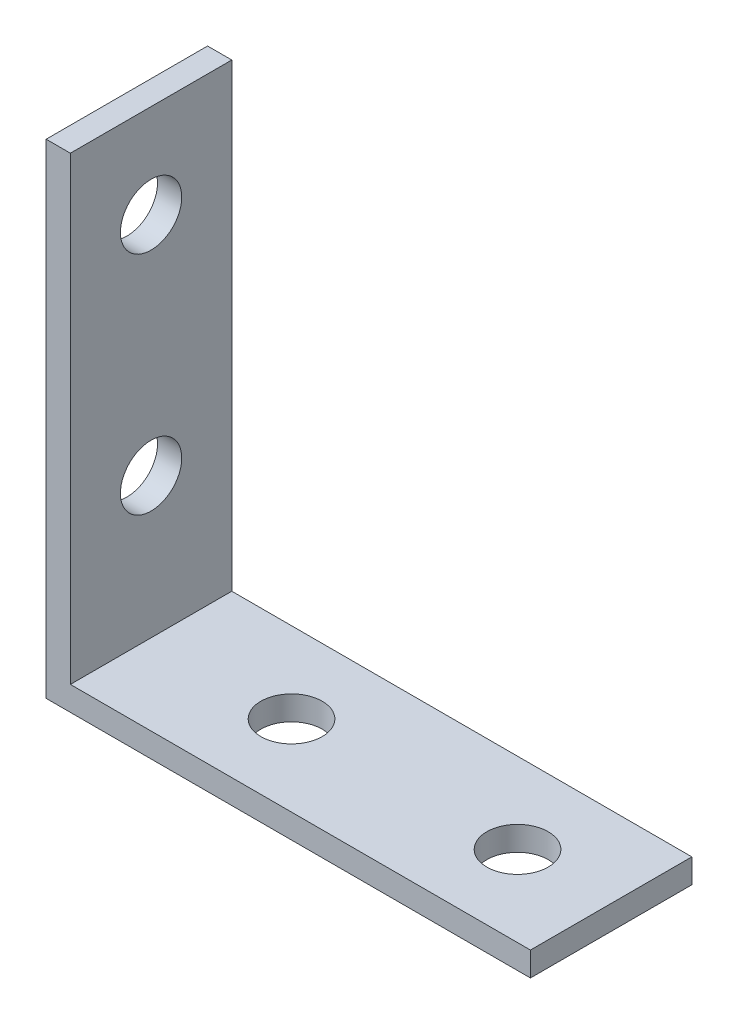
ISO-10303-21;
HEADER;
FILE_DESCRIPTION(('STEP AP214'),'2;1');
FILE_NAME('part.step','',(''),(''),'','','');
FILE_SCHEMA(('AUTOMOTIVE_DESIGN { 1 0 10303 214 1 1 1 1 }'));
ENDSEC;
DATA;
#1=APPLICATION_CONTEXT('core data for automotive mechanical design processes');
#2=APPLICATION_PROTOCOL_DEFINITION('international standard','automotive_design',2000,#1);
#3=PRODUCT_CONTEXT('',#1,'mechanical');
#4=PRODUCT('Part','Part','',(#3));
#5=PRODUCT_RELATED_PRODUCT_CATEGORY('part','',(#4));
#6=PRODUCT_DEFINITION_FORMATION('','',#4);
#7=PRODUCT_DEFINITION_CONTEXT('part definition',#1,'design');
#8=PRODUCT_DEFINITION('design','',#6,#7);
#9=PRODUCT_DEFINITION_SHAPE('','',#8);
#10=(LENGTH_UNIT() NAMED_UNIT(*) SI_UNIT(.MILLI.,.METRE.));
#11=(NAMED_UNIT(*) PLANE_ANGLE_UNIT() SI_UNIT($,.RADIAN.));
#12=(NAMED_UNIT(*) SI_UNIT($,.STERADIAN.) SOLID_ANGLE_UNIT());
#13=UNCERTAINTY_MEASURE_WITH_UNIT(LENGTH_MEASURE(1.E-05),#10,'distance_accuracy_value','');
#14=(GEOMETRIC_REPRESENTATION_CONTEXT(3) GLOBAL_UNCERTAINTY_ASSIGNED_CONTEXT((#13)) GLOBAL_UNIT_ASSIGNED_CONTEXT((#10,
#11,#12)) REPRESENTATION_CONTEXT('',''));
#15=CARTESIAN_POINT('',(0.,0.,0.));
#16=DIRECTION('',(0.,0.,1.));
#17=DIRECTION('',(1.,0.,0.));
#18=AXIS2_PLACEMENT_3D('',#15,#16,#17);
#19=CARTESIAN_POINT('',(38.1,0.,12.7));
#20=DIRECTION('',(0.,1.,0.));
#21=DIRECTION('',(-1.,0.,0.));
#22=AXIS2_PLACEMENT_3D('',#19,#20,#21);
#23=PLANE('',#22);
#24=CARTESIAN_POINT('',(30.734,0.,6.35));
#25=DIRECTION('',(0.,-1.,0.));
#26=DIRECTION('',(1.,0.,0.));
#27=AXIS2_PLACEMENT_3D('',#24,#25,#26);
#28=CIRCLE('',#27,2.413);
#29=CARTESIAN_POINT('',(33.147,0.,6.35));
#30=VERTEX_POINT('',#29);
#31=EDGE_CURVE('E163',#30,#30,#28,.T.);
#32=ORIENTED_EDGE('',*,*,#31,.F.);
#33=EDGE_LOOP('',(#32));
#34=FACE_BOUND('',#33,.T.);
#35=CARTESIAN_POINT('',(12.954,0.,6.35));
#36=DIRECTION('',(0.,-1.,0.));
#37=DIRECTION('',(1.,0.,0.));
#38=AXIS2_PLACEMENT_3D('',#35,#36,#37);
#39=CIRCLE('',#38,2.413);
#40=CARTESIAN_POINT('',(15.367,0.,6.35));
#41=VERTEX_POINT('',#40);
#42=EDGE_CURVE('E166',#41,#41,#39,.T.);
#43=ORIENTED_EDGE('',*,*,#42,.F.);
#44=EDGE_LOOP('',(#43));
#45=FACE_BOUND('',#44,.T.);
#46=DIRECTION('',(1.,0.,0.));
#47=VECTOR('',#46,1.);
#48=CARTESIAN_POINT('',(38.1,0.,0.));
#49=LINE('',#48,#47);
#50=CARTESIAN_POINT('',(0.,0.,0.));
#51=VERTEX_POINT('',#50);
#52=CARTESIAN_POINT('',(38.1,0.,0.));
#53=VERTEX_POINT('',#52);
#54=EDGE_CURVE('E117',#51,#53,#49,.T.);
#55=ORIENTED_EDGE('',*,*,#54,.T.);
#56=DIRECTION('',(0.,0.,-1.));
#57=VECTOR('',#56,1.);
#58=CARTESIAN_POINT('',(38.1,0.,12.7));
#59=LINE('',#58,#57);
#60=CARTESIAN_POINT('',(38.1,0.,12.7));
#61=VERTEX_POINT('',#60);
#62=EDGE_CURVE('E11',#61,#53,#59,.T.);
#63=ORIENTED_EDGE('',*,*,#62,.F.);
#64=DIRECTION('',(1.,0.,0.));
#65=VECTOR('',#64,1.);
#66=CARTESIAN_POINT('',(38.1,0.,12.7));
#67=LINE('',#66,#65);
#68=CARTESIAN_POINT('',(0.,0.,12.7));
#69=VERTEX_POINT('',#68);
#70=EDGE_CURVE('E128',#69,#61,#67,.T.);
#71=ORIENTED_EDGE('',*,*,#70,.F.);
#72=DIRECTION('',(0.,0.,-1.));
#73=VECTOR('',#72,1.);
#74=CARTESIAN_POINT('',(0.,0.,12.7));
#75=LINE('',#74,#73);
#76=EDGE_CURVE('E113',#69,#51,#75,.T.);
#77=ORIENTED_EDGE('',*,*,#76,.T.);
#78=EDGE_LOOP('',(#55,#63,#71,#77));
#79=FACE_BOUND('',#78,.T.);
#80=ADVANCED_FACE('F33',(#34,#45,#79),#23,.F.);
#81=CARTESIAN_POINT('',(38.1,1.905,12.7));
#82=DIRECTION('',(-1.,0.,0.));
#83=DIRECTION('',(0.,-1.,0.));
#84=AXIS2_PLACEMENT_3D('',#81,#82,#83);
#85=PLANE('',#84);
#86=DIRECTION('',(0.,1.,0.));
#87=VECTOR('',#86,1.);
#88=CARTESIAN_POINT('',(38.1,1.905,0.));
#89=LINE('',#88,#87);
#90=CARTESIAN_POINT('',(38.1,1.905,0.));
#91=VERTEX_POINT('',#90);
#92=EDGE_CURVE('E120',#53,#91,#89,.T.);
#93=ORIENTED_EDGE('',*,*,#92,.T.);
#94=DIRECTION('',(0.,0.,-1.));
#95=VECTOR('',#94,1.);
#96=CARTESIAN_POINT('',(38.1,1.905,12.7));
#97=LINE('',#96,#95);
#98=CARTESIAN_POINT('',(38.1,1.905,12.7));
#99=VERTEX_POINT('',#98);
#100=EDGE_CURVE('E41',#99,#91,#97,.T.);
#101=ORIENTED_EDGE('',*,*,#100,.F.);
#102=DIRECTION('',(0.,1.,0.));
#103=VECTOR('',#102,1.);
#104=CARTESIAN_POINT('',(38.1,1.905,12.7));
#105=LINE('',#104,#103);
#106=EDGE_CURVE('E86',#61,#99,#105,.T.);
#107=ORIENTED_EDGE('',*,*,#106,.F.);
#108=ORIENTED_EDGE('',*,*,#62,.T.);
#109=EDGE_LOOP('',(#93,#101,#107,#108));
#110=FACE_BOUND('',#109,.T.);
#111=ADVANCED_FACE('F155',(#110),#85,.F.);
#112=CARTESIAN_POINT('',(1.905,1.905,12.7));
#113=DIRECTION('',(0.,-1.,0.));
#114=DIRECTION('',(1.,0.,0.));
#115=AXIS2_PLACEMENT_3D('',#112,#113,#114);
#116=PLANE('',#115);
#117=CARTESIAN_POINT('',(30.734,1.90499999999997,6.35));
#118=DIRECTION('',(0.,-1.,0.));
#119=DIRECTION('',(1.,0.,0.));
#120=AXIS2_PLACEMENT_3D('',#117,#118,#119);
#121=CIRCLE('',#120,2.413);
#122=CARTESIAN_POINT('',(33.147,1.90499999999996,6.35));
#123=VERTEX_POINT('',#122);
#124=EDGE_CURVE('E168',#123,#123,#121,.T.);
#125=ORIENTED_EDGE('',*,*,#124,.T.);
#126=EDGE_LOOP('',(#125));
#127=FACE_BOUND('',#126,.T.);
#128=CARTESIAN_POINT('',(12.954,1.90499999999999,6.35));
#129=DIRECTION('',(0.,-1.,0.));
#130=DIRECTION('',(1.,0.,0.));
#131=AXIS2_PLACEMENT_3D('',#128,#129,#130);
#132=CIRCLE('',#131,2.413);
#133=CARTESIAN_POINT('',(15.367,1.90499999999999,6.35));
#134=VERTEX_POINT('',#133);
#135=EDGE_CURVE('E169',#134,#134,#132,.T.);
#136=ORIENTED_EDGE('',*,*,#135,.T.);
#137=EDGE_LOOP('',(#136));
#138=FACE_BOUND('',#137,.T.);
#139=DIRECTION('',(-1.,0.,0.));
#140=VECTOR('',#139,1.);
#141=CARTESIAN_POINT('',(1.905,1.905,0.));
#142=LINE('',#141,#140);
#143=CARTESIAN_POINT('',(1.905,1.905,0.));
#144=VERTEX_POINT('',#143);
#145=EDGE_CURVE('E123',#91,#144,#142,.T.);
#146=ORIENTED_EDGE('',*,*,#145,.T.);
#147=DIRECTION('',(0.,0.,-1.));
#148=VECTOR('',#147,1.);
#149=CARTESIAN_POINT('',(1.905,1.905,12.7));
#150=LINE('',#149,#148);
#151=CARTESIAN_POINT('',(1.905,1.905,12.7));
#152=VERTEX_POINT('',#151);
#153=EDGE_CURVE('E108',#152,#144,#150,.T.);
#154=ORIENTED_EDGE('',*,*,#153,.F.);
#155=DIRECTION('',(-1.,0.,0.));
#156=VECTOR('',#155,1.);
#157=CARTESIAN_POINT('',(1.905,1.905,12.7));
#158=LINE('',#157,#156);
#159=EDGE_CURVE('E99',#99,#152,#158,.T.);
#160=ORIENTED_EDGE('',*,*,#159,.F.);
#161=ORIENTED_EDGE('',*,*,#100,.T.);
#162=EDGE_LOOP('',(#146,#154,#160,#161));
#163=FACE_BOUND('',#162,.T.);
#164=ADVANCED_FACE('F134',(#127,#138,#163),#116,.F.);
#165=CARTESIAN_POINT('',(1.905,38.1,12.7));
#166=DIRECTION('',(-1.,0.,0.));
#167=DIRECTION('',(0.,-1.,0.));
#168=AXIS2_PLACEMENT_3D('',#165,#166,#167);
#169=PLANE('',#168);
#170=CARTESIAN_POINT('',(1.905,30.734,6.35));
#171=DIRECTION('',(1.,0.,0.));
#172=DIRECTION('',(0.,1.,0.));
#173=AXIS2_PLACEMENT_3D('',#170,#171,#172);
#174=CIRCLE('',#173,2.413);
#175=CARTESIAN_POINT('',(1.905,33.147,6.35));
#176=VERTEX_POINT('',#175);
#177=EDGE_CURVE('E178',#176,#176,#174,.T.);
#178=ORIENTED_EDGE('',*,*,#177,.F.);
#179=EDGE_LOOP('',(#178));
#180=FACE_BOUND('',#179,.T.);
#181=CARTESIAN_POINT('',(1.905,12.954,6.35));
#182=DIRECTION('',(1.,0.,0.));
#183=DIRECTION('',(0.,1.,0.));
#184=AXIS2_PLACEMENT_3D('',#181,#182,#183);
#185=CIRCLE('',#184,2.413);
#186=CARTESIAN_POINT('',(1.905,15.367,6.35));
#187=VERTEX_POINT('',#186);
#188=EDGE_CURVE('E184',#187,#187,#185,.T.);
#189=ORIENTED_EDGE('',*,*,#188,.F.);
#190=EDGE_LOOP('',(#189));
#191=FACE_BOUND('',#190,.T.);
#192=DIRECTION('',(0.,1.,0.));
#193=VECTOR('',#192,1.);
#194=CARTESIAN_POINT('',(1.905,38.1,0.));
#195=LINE('',#194,#193);
#196=CARTESIAN_POINT('',(1.905,38.1,0.));
#197=VERTEX_POINT('',#196);
#198=EDGE_CURVE('E107',#144,#197,#195,.T.);
#199=ORIENTED_EDGE('',*,*,#198,.T.);
#200=DIRECTION('',(0.,0.,-1.));
#201=VECTOR('',#200,1.);
#202=CARTESIAN_POINT('',(1.905,38.1,12.7));
#203=LINE('',#202,#201);
#204=CARTESIAN_POINT('',(1.905,38.1,12.7));
#205=VERTEX_POINT('',#204);
#206=EDGE_CURVE('E104',#205,#197,#203,.T.);
#207=ORIENTED_EDGE('',*,*,#206,.F.);
#208=DIRECTION('',(0.,1.,0.));
#209=VECTOR('',#208,1.);
#210=CARTESIAN_POINT('',(1.905,38.1,12.7));
#211=LINE('',#210,#209);
#212=EDGE_CURVE('E93',#152,#205,#211,.T.);
#213=ORIENTED_EDGE('',*,*,#212,.F.);
#214=ORIENTED_EDGE('',*,*,#153,.T.);
#215=EDGE_LOOP('',(#199,#207,#213,#214));
#216=FACE_BOUND('',#215,.T.);
#217=ADVANCED_FACE('F105',(#180,#191,#216),#169,.F.);
#218=CARTESIAN_POINT('',(0.,38.1,12.7));
#219=DIRECTION('',(0.,-1.,0.));
#220=DIRECTION('',(0.,0.,-1.));
#221=AXIS2_PLACEMENT_3D('',#218,#219,#220);
#222=PLANE('',#221);
#223=DIRECTION('',(-1.,0.,0.));
#224=VECTOR('',#223,1.);
#225=CARTESIAN_POINT('',(0.,38.1,0.));
#226=LINE('',#225,#224);
#227=CARTESIAN_POINT('',(0.,38.1,0.));
#228=VERTEX_POINT('',#227);
#229=EDGE_CURVE('E72',#197,#228,#226,.T.);
#230=ORIENTED_EDGE('',*,*,#229,.T.);
#231=DIRECTION('',(0.,0.,-1.));
#232=VECTOR('',#231,1.);
#233=CARTESIAN_POINT('',(0.,38.1,12.7));
#234=LINE('',#233,#232);
#235=CARTESIAN_POINT('',(0.,38.1,12.7));
#236=VERTEX_POINT('',#235);
#237=EDGE_CURVE('E109',#236,#228,#234,.T.);
#238=ORIENTED_EDGE('',*,*,#237,.F.);
#239=DIRECTION('',(-1.,0.,0.));
#240=VECTOR('',#239,1.);
#241=CARTESIAN_POINT('',(0.,38.1,12.7));
#242=LINE('',#241,#240);
#243=EDGE_CURVE('E97',#205,#236,#242,.T.);
#244=ORIENTED_EDGE('',*,*,#243,.F.);
#245=ORIENTED_EDGE('',*,*,#206,.T.);
#246=EDGE_LOOP('',(#230,#238,#244,#245));
#247=FACE_BOUND('',#246,.T.);
#248=ADVANCED_FACE('F111',(#247),#222,.F.);
#249=CARTESIAN_POINT('',(0.,0.,12.7));
#250=DIRECTION('',(1.,0.,0.));
#251=DIRECTION('',(0.,0.,-1.));
#252=AXIS2_PLACEMENT_3D('',#249,#250,#251);
#253=PLANE('',#252);
#254=CARTESIAN_POINT('',(0.,30.734,6.35));
#255=DIRECTION('',(1.,0.,0.));
#256=DIRECTION('',(0.,1.,0.));
#257=AXIS2_PLACEMENT_3D('',#254,#255,#256);
#258=CIRCLE('',#257,2.413);
#259=CARTESIAN_POINT('',(0.,33.147,6.35));
#260=VERTEX_POINT('',#259);
#261=EDGE_CURVE('E121',#260,#260,#258,.T.);
#262=ORIENTED_EDGE('',*,*,#261,.T.);
#263=EDGE_LOOP('',(#262));
#264=FACE_BOUND('',#263,.T.);
#265=CARTESIAN_POINT('',(0.,12.954,6.35));
#266=DIRECTION('',(1.,0.,0.));
#267=DIRECTION('',(0.,1.,0.));
#268=AXIS2_PLACEMENT_3D('',#265,#266,#267);
#269=CIRCLE('',#268,2.413);
#270=CARTESIAN_POINT('',(0.,15.367,6.35));
#271=VERTEX_POINT('',#270);
#272=EDGE_CURVE('E181',#271,#271,#269,.T.);
#273=ORIENTED_EDGE('',*,*,#272,.T.);
#274=EDGE_LOOP('',(#273));
#275=FACE_BOUND('',#274,.T.);
#276=DIRECTION('',(0.,-1.,0.));
#277=VECTOR('',#276,1.);
#278=CARTESIAN_POINT('',(0.,0.,0.));
#279=LINE('',#278,#277);
#280=EDGE_CURVE('E78',#228,#51,#279,.T.);
#281=ORIENTED_EDGE('',*,*,#280,.T.);
#282=ORIENTED_EDGE('',*,*,#76,.F.);
#283=DIRECTION('',(0.,-1.,0.));
#284=VECTOR('',#283,1.);
#285=CARTESIAN_POINT('',(0.,0.,12.7));
#286=LINE('',#285,#284);
#287=EDGE_CURVE('E49',#236,#69,#286,.T.);
#288=ORIENTED_EDGE('',*,*,#287,.F.);
#289=ORIENTED_EDGE('',*,*,#237,.T.);
#290=EDGE_LOOP('',(#281,#282,#288,#289));
#291=FACE_BOUND('',#290,.T.);
#292=ADVANCED_FACE('F141',(#264,#275,#291),#253,.F.);
#293=CARTESIAN_POINT('',(0.,0.,12.7));
#294=DIRECTION('',(0.,0.,-1.));
#295=DIRECTION('',(-1.,0.,0.));
#296=AXIS2_PLACEMENT_3D('',#293,#294,#295);
#297=PLANE('',#296);
#298=ORIENTED_EDGE('',*,*,#70,.T.);
#299=ORIENTED_EDGE('',*,*,#106,.T.);
#300=ORIENTED_EDGE('',*,*,#159,.T.);
#301=ORIENTED_EDGE('',*,*,#212,.T.);
#302=ORIENTED_EDGE('',*,*,#243,.T.);
#303=ORIENTED_EDGE('',*,*,#287,.T.);
#304=EDGE_LOOP('',(#298,#299,#300,#301,#302,#303));
#305=FACE_BOUND('',#304,.T.);
#306=ADVANCED_FACE('F95',(#305),#297,.F.);
#307=CARTESIAN_POINT('',(0.,0.,0.));
#308=DIRECTION('',(0.,0.,-1.));
#309=DIRECTION('',(-1.,0.,0.));
#310=AXIS2_PLACEMENT_3D('',#307,#308,#309);
#311=PLANE('',#310);
#312=ORIENTED_EDGE('',*,*,#54,.F.);
#313=ORIENTED_EDGE('',*,*,#280,.F.);
#314=ORIENTED_EDGE('',*,*,#229,.F.);
#315=ORIENTED_EDGE('',*,*,#198,.F.);
#316=ORIENTED_EDGE('',*,*,#145,.F.);
#317=ORIENTED_EDGE('',*,*,#92,.F.);
#318=EDGE_LOOP('',(#312,#313,#314,#315,#316,#317));
#319=FACE_BOUND('',#318,.T.);
#320=ADVANCED_FACE('F137',(#319),#311,.T.);
#321=CARTESIAN_POINT('',(0.,12.954,6.35));
#322=DIRECTION('',(1.,0.,0.));
#323=DIRECTION('',(0.,1.,0.));
#324=AXIS2_PLACEMENT_3D('',#321,#322,#323);
#325=CYLINDRICAL_SURFACE('',#324,2.413);
#326=ORIENTED_EDGE('',*,*,#272,.F.);
#327=EDGE_LOOP('',(#326));
#328=FACE_BOUND('',#327,.T.);
#329=ORIENTED_EDGE('',*,*,#188,.T.);
#330=EDGE_LOOP('',(#329));
#331=FACE_BOUND('',#330,.T.);
#332=ADVANCED_FACE('F209',(#328,#331),#325,.F.);
#333=CARTESIAN_POINT('',(0.,30.734,6.35));
#334=DIRECTION('',(1.,0.,0.));
#335=DIRECTION('',(0.,1.,0.));
#336=AXIS2_PLACEMENT_3D('',#333,#334,#335);
#337=CYLINDRICAL_SURFACE('',#336,2.413);
#338=ORIENTED_EDGE('',*,*,#261,.F.);
#339=EDGE_LOOP('',(#338));
#340=FACE_BOUND('',#339,.T.);
#341=ORIENTED_EDGE('',*,*,#177,.T.);
#342=EDGE_LOOP('',(#341));
#343=FACE_BOUND('',#342,.T.);
#344=ADVANCED_FACE('F204',(#340,#343),#337,.F.);
#345=CARTESIAN_POINT('',(12.954,0.,6.35));
#346=DIRECTION('',(0.,1.,0.));
#347=DIRECTION('',(-1.,0.,0.));
#348=AXIS2_PLACEMENT_3D('',#345,#346,#347);
#349=CYLINDRICAL_SURFACE('',#348,2.413);
#350=ORIENTED_EDGE('',*,*,#42,.T.);
#351=EDGE_LOOP('',(#350));
#352=FACE_BOUND('',#351,.T.);
#353=ORIENTED_EDGE('',*,*,#135,.F.);
#354=EDGE_LOOP('',(#353));
#355=FACE_BOUND('',#354,.T.);
#356=ADVANCED_FACE('F194',(#352,#355),#349,.F.);
#357=CARTESIAN_POINT('',(30.734,0.,6.35));
#358=DIRECTION('',(0.,1.,0.));
#359=DIRECTION('',(-1.,0.,0.));
#360=AXIS2_PLACEMENT_3D('',#357,#358,#359);
#361=CYLINDRICAL_SURFACE('',#360,2.413);
#362=ORIENTED_EDGE('',*,*,#31,.T.);
#363=EDGE_LOOP('',(#362));
#364=FACE_BOUND('',#363,.T.);
#365=ORIENTED_EDGE('',*,*,#124,.F.);
#366=EDGE_LOOP('',(#365));
#367=FACE_BOUND('',#366,.T.);
#368=ADVANCED_FACE('F191',(#364,#367),#361,.F.);
#369=CLOSED_SHELL('',(#80,#111,#164,#217,#248,#292,#306,#320,#332,#344,#356,#368));
#370=MANIFOLD_SOLID_BREP('B2',#369);
#371=ADVANCED_BREP_SHAPE_REPRESENTATION('',(#18,#370),#14);
#372=SHAPE_DEFINITION_REPRESENTATION(#9,#371);
ENDSEC;
END-ISO-10303-21;
